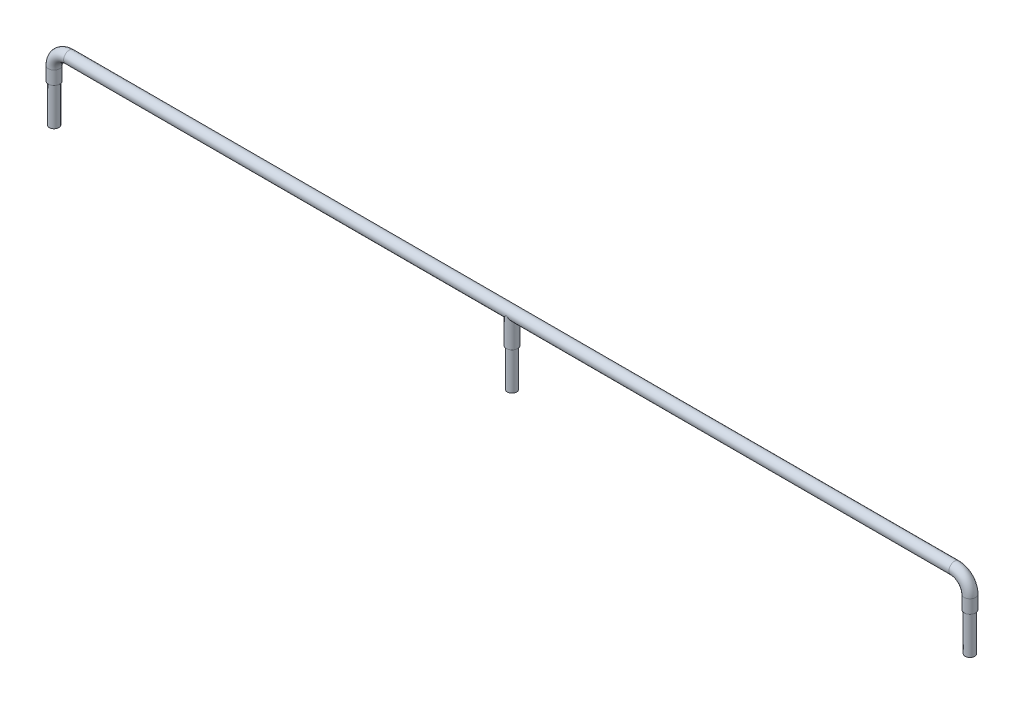
ISO-10303-21;
HEADER;
FILE_DESCRIPTION(('STEP AP214'),'2;1');
FILE_NAME('part.step','',(''),(''),'','','');
FILE_SCHEMA(('AUTOMOTIVE_DESIGN { 1 0 10303 214 1 1 1 1 }'));
ENDSEC;
DATA;
#1=APPLICATION_CONTEXT('core data for automotive mechanical design processes');
#2=APPLICATION_PROTOCOL_DEFINITION('international standard','automotive_design',2000,#1);
#3=PRODUCT_CONTEXT('',#1,'mechanical');
#4=PRODUCT('Part','Part','',(#3));
#5=PRODUCT_RELATED_PRODUCT_CATEGORY('part','',(#4));
#6=PRODUCT_DEFINITION_FORMATION('','',#4);
#7=PRODUCT_DEFINITION_CONTEXT('part definition',#1,'design');
#8=PRODUCT_DEFINITION('design','',#6,#7);
#9=PRODUCT_DEFINITION_SHAPE('','',#8);
#10=(LENGTH_UNIT() NAMED_UNIT(*) SI_UNIT(.MILLI.,.METRE.));
#11=(NAMED_UNIT(*) PLANE_ANGLE_UNIT() SI_UNIT($,.RADIAN.));
#12=(NAMED_UNIT(*) SI_UNIT($,.STERADIAN.) SOLID_ANGLE_UNIT());
#13=UNCERTAINTY_MEASURE_WITH_UNIT(LENGTH_MEASURE(1.E-05),#10,'distance_accuracy_value','');
#14=(GEOMETRIC_REPRESENTATION_CONTEXT(3) GLOBAL_UNCERTAINTY_ASSIGNED_CONTEXT((#13)) GLOBAL_UNIT_ASSIGNED_CONTEXT((#10,
#11,#12)) REPRESENTATION_CONTEXT('',''));
#15=CARTESIAN_POINT('',(0.,0.,0.));
#16=DIRECTION('',(0.,0.,1.));
#17=DIRECTION('',(1.,0.,0.));
#18=AXIS2_PLACEMENT_3D('',#15,#16,#17);
#19=CARTESIAN_POINT('',(2400.,6.10622663543836E-13,0.));
#20=DIRECTION('',(0.,1.,0.));
#21=DIRECTION('',(-1.,0.,0.));
#22=AXIS2_PLACEMENT_3D('',#19,#20,#21);
#23=PLANE('',#22);
#24=CARTESIAN_POINT('',(2400.,6.10622663543836E-13,0.));
#25=DIRECTION('',(0.,1.,0.));
#26=DIRECTION('',(-1.,0.,0.));
#27=AXIS2_PLACEMENT_3D('',#24,#25,#26);
#28=CIRCLE('',#27,19.9999999999998);
#29=CARTESIAN_POINT('',(2380.,5.11936172466045E-13,0.));
#30=VERTEX_POINT('',#29);
#31=EDGE_CURVE('E94',#30,#30,#28,.T.);
#32=ORIENTED_EDGE('',*,*,#31,.T.);
#33=EDGE_LOOP('',(#32));
#34=FACE_BOUND('',#33,.T.);
#35=CARTESIAN_POINT('',(2400.,3.94745964311167E-12,0.));
#36=DIRECTION('',(0.,-1.,0.));
#37=DIRECTION('',(1.,0.,0.));
#38=AXIS2_PLACEMENT_3D('',#35,#36,#37);
#39=CIRCLE('',#38,25.);
#40=CARTESIAN_POINT('',(2425.,3.98857901439409E-12,0.));
#41=VERTEX_POINT('',#40);
#42=EDGE_CURVE('E128',#41,#41,#39,.T.);
#43=ORIENTED_EDGE('',*,*,#42,.T.);
#44=EDGE_LOOP('',(#43));
#45=FACE_BOUND('',#44,.T.);
#46=ADVANCED_FACE('F47',(#34,#45),#23,.F.);
#47=CARTESIAN_POINT('',(2400.,270.,0.));
#48=DIRECTION('',(0.,-1.,0.));
#49=DIRECTION('',(1.,0.,0.));
#50=AXIS2_PLACEMENT_3D('',#47,#48,#49);
#51=CYLINDRICAL_SURFACE('',#50,29.9999999999998);
#52=CARTESIAN_POINT('',(2400.,270.00000000002,0.));
#53=DIRECTION('',(0.,1.,0.));
#54=DIRECTION('',(-1.,0.,0.));
#55=AXIS2_PLACEMENT_3D('',#52,#53,#54);
#56=CIRCLE('',#55,29.9999999999998);
#57=CARTESIAN_POINT('',(2430.,270.000000000027,0.));
#58=VERTEX_POINT('',#57);
#59=EDGE_CURVE('E59',#58,#58,#56,.T.);
#60=ORIENTED_EDGE('',*,*,#59,.F.);
#61=EDGE_LOOP('',(#60));
#62=FACE_BOUND('',#61,.T.);
#63=CARTESIAN_POINT('',(2400.,200.000000000004,0.));
#64=DIRECTION('',(0.,-1.,0.));
#65=DIRECTION('',(1.,0.,0.));
#66=AXIS2_PLACEMENT_3D('',#63,#64,#65);
#67=CIRCLE('',#66,29.9999999999998);
#68=CARTESIAN_POINT('',(2430.,200.000000000004,0.));
#69=VERTEX_POINT('',#68);
#70=EDGE_CURVE('E119',#69,#69,#67,.T.);
#71=ORIENTED_EDGE('',*,*,#70,.F.);
#72=EDGE_LOOP('',(#71));
#73=FACE_BOUND('',#72,.T.);
#74=ADVANCED_FACE('F113',(#62,#73),#51,.T.);
#75=CARTESIAN_POINT('',(-6.2501608826754E-13,380.001000000004,0.));
#76=DIRECTION('',(0.,-1.,0.));
#77=DIRECTION('',(1.,0.,0.));
#78=AXIS2_PLACEMENT_3D('',#75,#76,#77);
#79=CYLINDRICAL_SURFACE('',#78,29.9999999999998);
#80=CARTESIAN_POINT('',(-5.09880203901924E-13,350.,0.));
#81=DIRECTION('',(-0.707106781186547,-0.707106781186548,0.));
#82=DIRECTION('',(0.707106781186548,-0.707106781186547,0.));
#83=AXIS2_PLACEMENT_3D('',#80,#81,#82);
#84=ELLIPSE('',#83,42.4264068711926,29.9999999999998);
#85=CARTESIAN_POINT('',(-2.87835598976893E-13,350.,-29.9999999999998));
#86=VERTEX_POINT('',#85);
#87=CARTESIAN_POINT('',(-5.09880203901924E-13,350.,29.9999999999998));
#88=VERTEX_POINT('',#87);
#89=EDGE_CURVE('E67',#86,#88,#84,.T.);
#90=ORIENTED_EDGE('',*,*,#89,.T.);
#91=CARTESIAN_POINT('',(-5.09880203901924E-13,350.,0.));
#92=DIRECTION('',(0.707106781186548,-0.707106781186547,0.));
#93=DIRECTION('',(-0.707106781186547,-0.707106781186548,0.));
#94=AXIS2_PLACEMENT_3D('',#91,#92,#93);
#95=ELLIPSE('',#94,42.4264068711925,29.9999999999998);
#96=EDGE_CURVE('E65',#88,#86,#95,.T.);
#97=ORIENTED_EDGE('',*,*,#96,.T.);
#98=EDGE_LOOP('',(#90,#97));
#99=FACE_BOUND('',#98,.T.);
#100=CARTESIAN_POINT('',(-3.28954970259306E-13,200.,0.));
#101=DIRECTION('',(0.,-1.,0.));
#102=DIRECTION('',(1.,0.,0.));
#103=AXIS2_PLACEMENT_3D('',#100,#101,#102);
#104=CIRCLE('',#103,29.9999999999998);
#105=CARTESIAN_POINT('',(29.9999999999995,200.,0.));
#106=VERTEX_POINT('',#105);
#107=EDGE_CURVE('E137',#106,#106,#104,.T.);
#108=ORIENTED_EDGE('',*,*,#107,.F.);
#109=EDGE_LOOP('',(#108));
#110=FACE_BOUND('',#109,.T.);
#111=ADVANCED_FACE('F68',(#99,#110),#79,.T.);
#112=CARTESIAN_POINT('',(-2400.,7.28429662267951E-12,0.));
#113=DIRECTION('',(0.,-1.,0.));
#114=DIRECTION('',(1.,0.,0.));
#115=AXIS2_PLACEMENT_3D('',#112,#113,#114);
#116=PLANE('',#115);
#117=CARTESIAN_POINT('',(-2400.,7.28429662267951E-12,0.));
#118=DIRECTION('',(0.,-1.,0.));
#119=DIRECTION('',(1.,0.,0.));
#120=AXIS2_PLACEMENT_3D('',#117,#118,#119);
#121=CIRCLE('',#120,19.9999999999998);
#122=CARTESIAN_POINT('',(-2380.,7.31719211970544E-12,0.));
#123=VERTEX_POINT('',#122);
#124=EDGE_CURVE('E71',#123,#123,#121,.T.);
#125=ORIENTED_EDGE('',*,*,#124,.F.);
#126=EDGE_LOOP('',(#125));
#127=FACE_BOUND('',#126,.T.);
#128=CARTESIAN_POINT('',(-2400.,-3.94745964311167E-12,0.));
#129=DIRECTION('',(0.,-1.,0.));
#130=DIRECTION('',(1.,0.,0.));
#131=AXIS2_PLACEMENT_3D('',#128,#129,#130);
#132=CIRCLE('',#131,25.);
#133=CARTESIAN_POINT('',(-2375.,-3.90634027182926E-12,0.));
#134=VERTEX_POINT('',#133);
#135=EDGE_CURVE('E135',#134,#134,#132,.T.);
#136=ORIENTED_EDGE('',*,*,#135,.T.);
#137=EDGE_LOOP('',(#136));
#138=FACE_BOUND('',#137,.T.);
#139=ADVANCED_FACE('F49',(#127,#138),#116,.T.);
#140=CARTESIAN_POINT('',(-2400.,7.28429662267951E-12,0.));
#141=DIRECTION('',(0.,1.,0.));
#142=DIRECTION('',(0.,0.,1.));
#143=AXIS2_PLACEMENT_3D('',#140,#141,#142);
#144=CYLINDRICAL_SURFACE('',#143,29.9999999999998);
#145=CARTESIAN_POINT('',(-2400.,269.999999999999,0.));
#146=DIRECTION('',(0.,-1.,0.));
#147=DIRECTION('',(1.,0.,0.));
#148=AXIS2_PLACEMENT_3D('',#145,#146,#147);
#149=CIRCLE('',#148,29.9999999999998);
#150=CARTESIAN_POINT('',(-2430.,269.999999999999,0.));
#151=VERTEX_POINT('',#150);
#152=EDGE_CURVE('E99',#151,#151,#149,.T.);
#153=ORIENTED_EDGE('',*,*,#152,.T.);
#154=EDGE_LOOP('',(#153));
#155=FACE_BOUND('',#154,.T.);
#156=CARTESIAN_POINT('',(-2400.,199.999999999996,0.));
#157=DIRECTION('',(0.,-1.,0.));
#158=DIRECTION('',(1.,0.,0.));
#159=AXIS2_PLACEMENT_3D('',#156,#157,#158);
#160=CIRCLE('',#159,29.9999999999998);
#161=CARTESIAN_POINT('',(-2370.,199.999999999996,0.));
#162=VERTEX_POINT('',#161);
#163=EDGE_CURVE('E78',#162,#162,#160,.T.);
#164=ORIENTED_EDGE('',*,*,#163,.F.);
#165=EDGE_LOOP('',(#164));
#166=FACE_BOUND('',#165,.T.);
#167=ADVANCED_FACE('F143',(#155,#166),#144,.T.);
#168=CARTESIAN_POINT('',(-2320.,270.,0.));
#169=DIRECTION('',(0.,0.,-1.));
#170=DIRECTION('',(-1.,0.,0.));
#171=AXIS2_PLACEMENT_3D('',#168,#169,#170);
#172=TOROIDAL_SURFACE('',#171,80.0000000000001,29.9999999999998);
#173=CARTESIAN_POINT('',(-2320.,350.,0.));
#174=DIRECTION('',(-1.,0.,0.));
#175=DIRECTION('',(0.,-1.,0.));
#176=AXIS2_PLACEMENT_3D('',#173,#174,#175);
#177=CIRCLE('',#176,29.9999999999998);
#178=CARTESIAN_POINT('',(-2320.,380.,0.));
#179=VERTEX_POINT('',#178);
#180=EDGE_CURVE('E102',#179,#179,#177,.T.);
#181=CARTESIAN_POINT('',(-2320.,270.,0.));
#182=DIRECTION('',(0.,0.,-1.));
#183=DIRECTION('',(-1.,0.,0.));
#184=AXIS2_PLACEMENT_3D('',#181,#182,#183);
#185=CIRCLE('',#184,110.);
#186=EDGE_CURVE('',#151,#179,#185,.T.);
#187=ORIENTED_EDGE('',*,*,#152,.F.);
#188=ORIENTED_EDGE('',*,*,#180,.T.);
#189=ORIENTED_EDGE('',*,*,#186,.T.);
#190=ORIENTED_EDGE('',*,*,#186,.F.);
#191=EDGE_LOOP('',(#187,#189,#188,#190));
#192=FACE_BOUND('',#191,.T.);
#193=ADVANCED_FACE('F145',(#192),#172,.T.);
#194=CARTESIAN_POINT('',(-2320.,350.,0.));
#195=DIRECTION('',(1.,0.,0.));
#196=DIRECTION('',(0.,1.,0.));
#197=AXIS2_PLACEMENT_3D('',#194,#195,#196);
#198=CYLINDRICAL_SURFACE('',#197,29.9999999999998);
#199=ORIENTED_EDGE('',*,*,#89,.F.);
#200=ORIENTED_EDGE('',*,*,#96,.F.);
#201=EDGE_LOOP('',(#199,#200));
#202=FACE_BOUND('',#201,.T.);
#203=CARTESIAN_POINT('',(2320.,350.000000000001,0.));
#204=DIRECTION('',(-1.,0.,0.));
#205=DIRECTION('',(0.,-1.,0.));
#206=AXIS2_PLACEMENT_3D('',#203,#204,#205);
#207=CIRCLE('',#206,29.9999999999998);
#208=CARTESIAN_POINT('',(2320.,380.,0.));
#209=VERTEX_POINT('',#208);
#210=EDGE_CURVE('E105',#209,#209,#207,.T.);
#211=ORIENTED_EDGE('',*,*,#210,.T.);
#212=EDGE_LOOP('',(#211));
#213=FACE_BOUND('',#212,.T.);
#214=ORIENTED_EDGE('',*,*,#180,.F.);
#215=EDGE_LOOP('',(#214));
#216=FACE_BOUND('',#215,.T.);
#217=ADVANCED_FACE('F73',(#202,#213,#216),#198,.T.);
#218=CARTESIAN_POINT('',(2320.,270.000000000001,0.));
#219=DIRECTION('',(0.,0.,-1.));
#220=DIRECTION('',(-1.,0.,0.));
#221=AXIS2_PLACEMENT_3D('',#218,#219,#220);
#222=TOROIDAL_SURFACE('',#221,79.9999999999998,29.9999999999998);
#223=CARTESIAN_POINT('',(2320.,270.000000000001,0.));
#224=DIRECTION('',(0.,0.,-1.));
#225=DIRECTION('',(-1.,0.,0.));
#226=AXIS2_PLACEMENT_3D('',#223,#224,#225);
#227=CIRCLE('',#226,110.);
#228=EDGE_CURVE('',#209,#58,#227,.T.);
#229=ORIENTED_EDGE('',*,*,#210,.F.);
#230=ORIENTED_EDGE('',*,*,#59,.T.);
#231=ORIENTED_EDGE('',*,*,#228,.T.);
#232=ORIENTED_EDGE('',*,*,#228,.F.);
#233=EDGE_LOOP('',(#229,#231,#230,#232));
#234=FACE_BOUND('',#233,.T.);
#235=ADVANCED_FACE('F110',(#234),#222,.T.);
#236=CARTESIAN_POINT('',(-2400.,7.28429662267951E-12,0.));
#237=DIRECTION('',(0.,1.,0.));
#238=DIRECTION('',(0.,0.,1.));
#239=AXIS2_PLACEMENT_3D('',#236,#237,#238);
#240=CYLINDRICAL_SURFACE('',#239,19.9999999999998);
#241=CARTESIAN_POINT('',(-2400.,269.999999999999,0.));
#242=DIRECTION('',(0.,1.,0.));
#243=DIRECTION('',(0.,0.,1.));
#244=AXIS2_PLACEMENT_3D('',#241,#242,#243);
#245=CIRCLE('',#244,19.9999999999998);
#246=CARTESIAN_POINT('',(-2420.,269.999999999999,0.));
#247=VERTEX_POINT('',#246);
#248=EDGE_CURVE('E82',#247,#247,#245,.F.);
#249=ORIENTED_EDGE('',*,*,#248,.F.);
#250=EDGE_LOOP('',(#249));
#251=FACE_BOUND('',#250,.T.);
#252=ORIENTED_EDGE('',*,*,#124,.T.);
#253=EDGE_LOOP('',(#252));
#254=FACE_BOUND('',#253,.T.);
#255=ADVANCED_FACE('F158',(#251,#254),#240,.F.);
#256=CARTESIAN_POINT('',(-2320.,270.,0.));
#257=DIRECTION('',(0.,0.,-1.));
#258=DIRECTION('',(-1.,0.,0.));
#259=AXIS2_PLACEMENT_3D('',#256,#257,#258);
#260=TOROIDAL_SURFACE('',#259,80.0000000000001,19.9999999999998);
#261=CARTESIAN_POINT('',(-2320.,350.,0.));
#262=DIRECTION('',(-1.,0.,0.));
#263=DIRECTION('',(0.,-1.,0.));
#264=AXIS2_PLACEMENT_3D('',#261,#262,#263);
#265=CIRCLE('',#264,19.9999999999998);
#266=CARTESIAN_POINT('',(-2320.,370.,0.));
#267=VERTEX_POINT('',#266);
#268=EDGE_CURVE('E85',#267,#267,#265,.T.);
#269=CARTESIAN_POINT('',(-2320.,270.,0.));
#270=DIRECTION('',(0.,0.,-1.));
#271=DIRECTION('',(-1.,0.,0.));
#272=AXIS2_PLACEMENT_3D('',#269,#270,#271);
#273=CIRCLE('',#272,99.9999999999999);
#274=EDGE_CURVE('',#247,#267,#273,.T.);
#275=ORIENTED_EDGE('',*,*,#248,.T.);
#276=ORIENTED_EDGE('',*,*,#268,.F.);
#277=ORIENTED_EDGE('',*,*,#274,.T.);
#278=ORIENTED_EDGE('',*,*,#274,.F.);
#279=EDGE_LOOP('',(#275,#277,#276,#278));
#280=FACE_BOUND('',#279,.T.);
#281=ADVANCED_FACE('F211',(#280),#260,.F.);
#282=CARTESIAN_POINT('',(-2320.,350.,0.));
#283=DIRECTION('',(1.,0.,0.));
#284=DIRECTION('',(0.,1.,0.));
#285=AXIS2_PLACEMENT_3D('',#282,#283,#284);
#286=CYLINDRICAL_SURFACE('',#285,19.9999999999998);
#287=CARTESIAN_POINT('',(2320.,350.000000000001,0.));
#288=DIRECTION('',(1.,0.,0.));
#289=DIRECTION('',(0.,1.,0.));
#290=AXIS2_PLACEMENT_3D('',#287,#288,#289);
#291=CIRCLE('',#290,19.9999999999998);
#292=CARTESIAN_POINT('',(2320.,370.,0.));
#293=VERTEX_POINT('',#292);
#294=EDGE_CURVE('E88',#293,#293,#291,.F.);
#295=ORIENTED_EDGE('',*,*,#294,.F.);
#296=EDGE_LOOP('',(#295));
#297=FACE_BOUND('',#296,.T.);
#298=ORIENTED_EDGE('',*,*,#268,.T.);
#299=EDGE_LOOP('',(#298));
#300=FACE_BOUND('',#299,.T.);
#301=ADVANCED_FACE('F215',(#297,#300),#286,.F.);
#302=CARTESIAN_POINT('',(2320.,270.000000000001,0.));
#303=DIRECTION('',(0.,0.,-1.));
#304=DIRECTION('',(-1.,0.,0.));
#305=AXIS2_PLACEMENT_3D('',#302,#303,#304);
#306=TOROIDAL_SURFACE('',#305,79.9999999999998,19.9999999999998);
#307=CARTESIAN_POINT('',(2400.,270.000000000015,0.));
#308=DIRECTION('',(-1.75537702570689E-13,1.,0.));
#309=DIRECTION('',(-1.,-1.75537702570689E-13,0.));
#310=AXIS2_PLACEMENT_3D('',#307,#308,#309);
#311=CIRCLE('',#310,19.9999999999998);
#312=CARTESIAN_POINT('',(2420.,270.000000000018,0.));
#313=VERTEX_POINT('',#312);
#314=EDGE_CURVE('E91',#313,#313,#311,.T.);
#315=CARTESIAN_POINT('',(2320.,270.000000000001,0.));
#316=DIRECTION('',(0.,0.,-1.));
#317=DIRECTION('',(-1.,0.,0.));
#318=AXIS2_PLACEMENT_3D('',#315,#316,#317);
#319=CIRCLE('',#318,99.9999999999996);
#320=EDGE_CURVE('',#293,#313,#319,.T.);
#321=ORIENTED_EDGE('',*,*,#294,.T.);
#322=ORIENTED_EDGE('',*,*,#314,.F.);
#323=ORIENTED_EDGE('',*,*,#320,.T.);
#324=ORIENTED_EDGE('',*,*,#320,.F.);
#325=EDGE_LOOP('',(#321,#323,#322,#324));
#326=FACE_BOUND('',#325,.T.);
#327=ADVANCED_FACE('F219',(#326),#306,.F.);
#328=CARTESIAN_POINT('',(2400.,270.,0.));
#329=DIRECTION('',(0.,-1.,0.));
#330=DIRECTION('',(1.,0.,0.));
#331=AXIS2_PLACEMENT_3D('',#328,#329,#330);
#332=CYLINDRICAL_SURFACE('',#331,19.9999999999998);
#333=ORIENTED_EDGE('',*,*,#31,.F.);
#334=EDGE_LOOP('',(#333));
#335=FACE_BOUND('',#334,.T.);
#336=ORIENTED_EDGE('',*,*,#314,.T.);
#337=EDGE_LOOP('',(#336));
#338=FACE_BOUND('',#337,.T.);
#339=ADVANCED_FACE('F154',(#335,#338),#332,.F.);
#340=CARTESIAN_POINT('',(-2400.,199.999999999996,0.));
#341=DIRECTION('',(0.,-1.,0.));
#342=DIRECTION('',(1.,0.,0.));
#343=AXIS2_PLACEMENT_3D('',#340,#341,#342);
#344=PLANE('',#343);
#345=CARTESIAN_POINT('',(-2400.,199.999999999996,0.));
#346=DIRECTION('',(0.,-1.,0.));
#347=DIRECTION('',(1.,0.,0.));
#348=AXIS2_PLACEMENT_3D('',#345,#346,#347);
#349=CIRCLE('',#348,25.);
#350=CARTESIAN_POINT('',(-2375.,199.999999999996,0.));
#351=VERTEX_POINT('',#350);
#352=EDGE_CURVE('E132',#351,#351,#349,.T.);
#353=ORIENTED_EDGE('',*,*,#352,.F.);
#354=EDGE_LOOP('',(#353));
#355=FACE_BOUND('',#354,.T.);
#356=ORIENTED_EDGE('',*,*,#163,.T.);
#357=EDGE_LOOP('',(#356));
#358=FACE_BOUND('',#357,.T.);
#359=ADVANCED_FACE('F141',(#355,#358),#344,.T.);
#360=CARTESIAN_POINT('',(-2400.,199.999999999996,0.));
#361=DIRECTION('',(0.,-1.,0.));
#362=DIRECTION('',(1.,0.,0.));
#363=AXIS2_PLACEMENT_3D('',#360,#361,#362);
#364=CYLINDRICAL_SURFACE('',#363,25.);
#365=ORIENTED_EDGE('',*,*,#352,.T.);
#366=EDGE_LOOP('',(#365));
#367=FACE_BOUND('',#366,.T.);
#368=ORIENTED_EDGE('',*,*,#135,.F.);
#369=EDGE_LOOP('',(#368));
#370=FACE_BOUND('',#369,.T.);
#371=ADVANCED_FACE('F196',(#367,#370),#364,.T.);
#372=CARTESIAN_POINT('',(-3.28954970259306E-13,200.,0.));
#373=DIRECTION('',(0.,-1.,0.));
#374=DIRECTION('',(1.,0.,0.));
#375=AXIS2_PLACEMENT_3D('',#372,#373,#374);
#376=PLANE('',#375);
#377=CARTESIAN_POINT('',(-3.28954970259306E-13,200.,0.));
#378=DIRECTION('',(0.,-1.,0.));
#379=DIRECTION('',(1.,0.,0.));
#380=AXIS2_PLACEMENT_3D('',#377,#378,#379);
#381=CIRCLE('',#380,25.);
#382=CARTESIAN_POINT('',(24.9999999999997,200.,0.));
#383=VERTEX_POINT('',#382);
#384=EDGE_CURVE('E125',#383,#383,#381,.T.);
#385=ORIENTED_EDGE('',*,*,#384,.F.);
#386=EDGE_LOOP('',(#385));
#387=FACE_BOUND('',#386,.T.);
#388=ORIENTED_EDGE('',*,*,#107,.T.);
#389=EDGE_LOOP('',(#388));
#390=FACE_BOUND('',#389,.T.);
#391=ADVANCED_FACE('F193',(#387,#390),#376,.T.);
#392=CARTESIAN_POINT('',(-3.28954970259306E-13,200.,0.));
#393=DIRECTION('',(0.,-1.,0.));
#394=DIRECTION('',(1.,0.,0.));
#395=AXIS2_PLACEMENT_3D('',#392,#393,#394);
#396=CYLINDRICAL_SURFACE('',#395,25.);
#397=ORIENTED_EDGE('',*,*,#384,.T.);
#398=EDGE_LOOP('',(#397));
#399=FACE_BOUND('',#398,.T.);
#400=CARTESIAN_POINT('',(0.,0.,0.));
#401=DIRECTION('',(0.,-1.,0.));
#402=DIRECTION('',(1.,0.,0.));
#403=AXIS2_PLACEMENT_3D('',#400,#401,#402);
#404=CIRCLE('',#403,25.);
#405=CARTESIAN_POINT('',(25.,0.,0.));
#406=VERTEX_POINT('',#405);
#407=EDGE_CURVE('E121',#406,#406,#404,.T.);
#408=ORIENTED_EDGE('',*,*,#407,.F.);
#409=EDGE_LOOP('',(#408));
#410=FACE_BOUND('',#409,.T.);
#411=ADVANCED_FACE('F188',(#399,#410),#396,.T.);
#412=CARTESIAN_POINT('',(2400.,200.000000000004,0.));
#413=DIRECTION('',(0.,-1.,0.));
#414=DIRECTION('',(1.,0.,0.));
#415=AXIS2_PLACEMENT_3D('',#412,#413,#414);
#416=PLANE('',#415);
#417=CARTESIAN_POINT('',(2400.,200.000000000004,0.));
#418=DIRECTION('',(0.,-1.,0.));
#419=DIRECTION('',(1.,0.,0.));
#420=AXIS2_PLACEMENT_3D('',#417,#418,#419);
#421=CIRCLE('',#420,25.);
#422=CARTESIAN_POINT('',(2425.,200.000000000004,0.));
#423=VERTEX_POINT('',#422);
#424=EDGE_CURVE('E122',#423,#423,#421,.T.);
#425=ORIENTED_EDGE('',*,*,#424,.F.);
#426=EDGE_LOOP('',(#425));
#427=FACE_BOUND('',#426,.T.);
#428=ORIENTED_EDGE('',*,*,#70,.T.);
#429=EDGE_LOOP('',(#428));
#430=FACE_BOUND('',#429,.T.);
#431=ADVANCED_FACE('F180',(#427,#430),#416,.T.);
#432=CARTESIAN_POINT('',(2400.,200.000000000004,0.));
#433=DIRECTION('',(0.,-1.,0.));
#434=DIRECTION('',(1.,0.,0.));
#435=AXIS2_PLACEMENT_3D('',#432,#433,#434);
#436=CYLINDRICAL_SURFACE('',#435,25.);
#437=ORIENTED_EDGE('',*,*,#424,.T.);
#438=EDGE_LOOP('',(#437));
#439=FACE_BOUND('',#438,.T.);
#440=ORIENTED_EDGE('',*,*,#42,.F.);
#441=EDGE_LOOP('',(#440));
#442=FACE_BOUND('',#441,.T.);
#443=ADVANCED_FACE('F172',(#439,#442),#436,.T.);
#444=CARTESIAN_POINT('',(19.9999999999995,320.,0.));
#445=CARTESIAN_POINT('',(19.999999870815,320.000000133802,-0.502432050357106));
#446=CARTESIAN_POINT('',(19.9810418902205,320.012648723208,-1.00486659291617));
#447=CARTESIAN_POINT('',(19.9055087079436,320.062924549288,-2.00562861223446));
#448=CARTESIAN_POINT('',(19.848933308268,320.100551917434,-2.50395606736271));
#449=CARTESIAN_POINT('',(19.6990002879962,320.199874786451,-3.49278874290094));
#450=CARTESIAN_POINT('',(19.6056283291336,320.261579669351,-3.98329083644028));
#451=CARTESIAN_POINT('',(19.3834395211624,320.4075901339,-4.95273670189949));
#452=CARTESIAN_POINT('',(19.2546222434638,320.491895988829,-5.43168033398314));
#453=CARTESIAN_POINT('',(18.9639204802119,320.680754864915,-6.37268315299049));
#454=CARTESIAN_POINT('',(18.8021969068237,320.785209235055,-6.83481207132657));
#455=CARTESIAN_POINT('',(18.4471586375464,321.012432664341,-7.74207070686116));
#456=CARTESIAN_POINT('',(18.2538441050979,321.135201628734,-8.1872005119924));
#457=CARTESIAN_POINT('',(17.8375381124744,321.396651799699,-9.05844037609496));
#458=CARTESIAN_POINT('',(17.6145476201092,321.535332487327,-9.48455105472423));
#459=CARTESIAN_POINT('',(17.1407197895652,321.826088675287,-10.3162415378409));
#460=CARTESIAN_POINT('',(16.8898791680595,321.978165754518,-10.7218189133777));
#461=CARTESIAN_POINT('',(16.3397046695654,322.306442158243,-11.544666651525));
#462=CARTESIAN_POINT('',(16.0380625153583,322.483593497589,-11.9600134544701));
#463=CARTESIAN_POINT('',(15.4060039283262,322.847134378905,-12.7638755092378));
#464=CARTESIAN_POINT('',(15.0755861890751,323.033524340148,-13.1523895414017));
#465=CARTESIAN_POINT('',(14.3871695519224,323.4122603668,-13.9021114634373));
#466=CARTESIAN_POINT('',(14.0291344326557,323.604614049252,-14.2632822184454));
#467=CARTESIAN_POINT('',(13.2872215493214,323.991346944818,-14.9568597365415));
#468=CARTESIAN_POINT('',(12.9033422589609,324.185726276988,-15.2892647981446));
#469=CARTESIAN_POINT('',(12.0482275933548,324.603163351101,-15.9745417178036));
#470=CARTESIAN_POINT('',(11.5727693191122,324.825903463734,-16.3223586443349));
#471=CARTESIAN_POINT('',(10.5899657994351,325.262306065545,-16.9764877633748));
#472=CARTESIAN_POINT('',(10.0826133516478,325.475966485955,-17.2827905315005));
#473=CARTESIAN_POINT('',(9.03819236671085,325.886545802438,-17.8511644026811));
#474=CARTESIAN_POINT('',(8.50116549380695,326.083487233875,-18.1132955295477));
#475=CARTESIAN_POINT('',(7.39870988362494,326.452778856693,-18.5908454263022));
#476=CARTESIAN_POINT('',(6.83329494919993,326.625140845503,-18.8062866319954));
#477=CARTESIAN_POINT('',(5.84404921175341,326.891644530006,-19.13202887715));
#478=CARTESIAN_POINT('',(5.42648017350454,326.994001174351,-19.254726201792));
#479=CARTESIAN_POINT('',(4.58008091505651,327.178809682322,-19.4734126020971));
#480=CARTESIAN_POINT('',(4.15125254556373,327.261264794751,-19.5694060373963));
#481=CARTESIAN_POINT('',(3.28516192271584,327.40331572389,-19.7332623242764));
#482=CARTESIAN_POINT('',(2.84791313270926,327.462945289373,-19.8011667190628));
#483=CARTESIAN_POINT('',(1.967177471033,327.557224813252,-19.9079619855319));
#484=CARTESIAN_POINT('',(1.52369056519011,327.591874634753,-19.9468526982109));
#485=CARTESIAN_POINT('',(0.631973802665473,327.634842195251,-19.995018995311));
#486=CARTESIAN_POINT('',(0.183731910266949,327.643050298475,-20.0041712760879));
#487=CARTESIAN_POINT('',(-0.71203065874094,327.632469830899,-19.9923398271623));
#488=CARTESIAN_POINT('',(-1.15955133289529,327.613681168395,-19.971355995093));
#489=CARTESIAN_POINT('',(-2.05062509539248,327.54989131428,-19.8996205096492));
#490=CARTESIAN_POINT('',(-2.4941749867726,327.504870645867,-19.8488467375743));
#491=CARTESIAN_POINT('',(-3.3737749273935,327.390441834478,-19.7184018881212));
#492=CARTESIAN_POINT('',(-3.80982483343092,327.321033226384,-19.6387302596127));
#493=CARTESIAN_POINT('',(-4.65260599507418,327.163997959636,-19.4558684710411));
#494=CARTESIAN_POINT('',(-5.05977803330703,327.077320501357,-19.3538839737257));
#495=CARTESIAN_POINT('',(-5.86323587316221,326.886691047175,-19.1258219416928));
#496=CARTESIAN_POINT('',(-6.25951739443538,326.782732369186,-18.9997350845369));
#497=CARTESIAN_POINT('',(-7.42993067111899,326.449099473677,-18.5870898788948));
#498=CARTESIAN_POINT('',(-8.18608179416553,326.19757909867,-18.2660472919538));
#499=CARTESIAN_POINT('',(-9.3522872667311,325.765743067048,-17.6854431992286));
#500=CARTESIAN_POINT('',(-9.78032481496484,325.596922682217,-17.4522559964646));
#501=CARTESIAN_POINT('',(-10.6157476442307,325.250256729435,-16.957048387659));
#502=CARTESIAN_POINT('',(-11.0231309475294,325.072410300451,-16.6950252280376));
#503=CARTESIAN_POINT('',(-11.8167546644326,324.711453105028,-16.1430567151302));
#504=CARTESIAN_POINT('',(-12.2029713238626,324.528336762114,-15.8530809594393));
#505=CARTESIAN_POINT('',(-12.9530389311321,324.160603494803,-15.246358714758));
#506=CARTESIAN_POINT('',(-13.3168883905752,323.975986471467,-14.9296104475492));
#507=CARTESIAN_POINT('',(-14.0973031971295,323.568950226168,-14.1989483888887));
#508=CARTESIAN_POINT('',(-14.5083033678115,323.346969604331,-13.7788159652826));
#509=CARTESIAN_POINT('',(-15.2937513429526,322.911403466383,-12.9014676729699));
#510=CARTESIAN_POINT('',(-15.6681924187191,322.697819499979,-12.4442450060577));
#511=CARTESIAN_POINT('',(-16.3775183221483,322.284659865137,-11.494686117609));
#512=CARTESIAN_POINT('',(-16.7124321311589,322.085073977438,-11.0023760522688));
#513=CARTESIAN_POINT('',(-17.3397652164751,321.705032372085,-9.9844735424079));
#514=CARTESIAN_POINT('',(-17.6321961852132,321.524571394447,-9.45889031296233));
#515=CARTESIAN_POINT('',(-18.1181905483141,321.220835593119,-8.48334612274983));
#516=CARTESIAN_POINT('',(-18.3198975753376,321.093285202127,-8.03875717640129));
#517=CARTESIAN_POINT('',(-18.6916231628035,320.856282694799,-7.13185034835589));
#518=CARTESIAN_POINT('',(-18.8616454276108,320.746828462953,-6.66953454679123));
#519=CARTESIAN_POINT('',(-19.1679937956708,320.548372248578,-5.72992272771904));
#520=CARTESIAN_POINT('',(-19.3043425302526,320.459356532561,-5.25263701566206));
#521=CARTESIAN_POINT('',(-19.5417523912569,320.303669450775,-4.28575432400361));
#522=CARTESIAN_POINT('',(-19.6428129748482,320.236998428731,-3.7961571551415));
#523=CARTESIAN_POINT('',(-19.8085733139668,320.127342105029,-2.80597314349139));
#524=CARTESIAN_POINT('',(-19.8731120951369,320.084461679353,-2.3053475990311));
#525=CARTESIAN_POINT('',(-19.9641545523489,320.023904397846,-1.29911991465971));
#526=CARTESIAN_POINT('',(-19.990658178691,320.00622757495,-0.793517768246678));
#527=CARTESIAN_POINT('',(-20.005208032861,319.996528204881,0.218464736426903));
#528=CARTESIAN_POINT('',(-19.9932558457623,320.004504600334,0.724845061752529));
#529=CARTESIAN_POINT('',(-19.9310874554946,320.045906676834,1.7341815678445));
#530=CARTESIAN_POINT('',(-19.880872885445,320.079331271698,2.23713789382999));
#531=CARTESIAN_POINT('',(-19.7478312691319,320.167558549307,3.2004217641102));
#532=CARTESIAN_POINT('',(-19.6675483452088,320.22069099574,3.66125811656805));
#533=CARTESIAN_POINT('',(-19.4756341111477,320.347089351856,4.57350157570495));
#534=CARTESIAN_POINT('',(-19.364004565487,320.4203541283,5.02490921158309));
#535=CARTESIAN_POINT('',(-19.1106977521886,320.585555333433,5.91571607198143));
#536=CARTESIAN_POINT('',(-18.9690185284523,320.677492977624,6.35511451265412));
#537=CARTESIAN_POINT('',(-18.6571079304237,320.878299505293,7.21966385402612));
#538=CARTESIAN_POINT('',(-18.4868750352666,320.987169290612,7.64481399436492));
#539=CARTESIAN_POINT('',(-18.1083152340673,321.226951155758,8.50426678457429));
#540=CARTESIAN_POINT('',(-17.8983067263238,321.358798308333,8.93756698372219));
#541=CARTESIAN_POINT('',(-17.4498297986436,321.636896978886,9.78432512725692));
#542=CARTESIAN_POINT('',(-17.211360522316,321.783148930285,10.1977824740428));
#543=CARTESIAN_POINT('',(-16.707624201864,322.08755814064,11.0036909497808));
#544=CARTESIAN_POINT('',(-16.4423452174866,322.245720696165,11.3961325988639));
#545=CARTESIAN_POINT('',(-15.8866695617361,322.571263831729,12.1587990167242));
#546=CARTESIAN_POINT('',(-15.596270090312,322.73864543861,12.5290213010129));
#547=CARTESIAN_POINT('',(-14.9439528947202,323.106912025991,13.303134717869));
#548=CARTESIAN_POINT('',(-14.5779874749771,323.308909483677,13.703092384124));
#549=CARTESIAN_POINT('',(-13.8160664974295,323.7173017054,14.4709683638238));
#550=CARTESIAN_POINT('',(-13.4201069693148,323.923697048974,14.8388824217614));
#551=CARTESIAN_POINT('',(-12.5994023240141,324.336426030242,15.5417880165118));
#552=CARTESIAN_POINT('',(-12.1746378391387,324.542759530822,15.8767570235969));
#553=CARTESIAN_POINT('',(-11.2977646153292,324.950273850767,16.5122275702685));
#554=CARTESIAN_POINT('',(-10.8456586765934,325.151455194802,16.8127326304099));
#555=CARTESIAN_POINT('',(-9.95448274755351,325.526697697001,17.3538627139577));
#556=CARTESIAN_POINT('',(-9.51754297050587,325.701613634313,17.5974024349064));
#557=CARTESIAN_POINT('',(-8.62244520074642,326.038059275326,18.0528546349535));
#558=CARTESIAN_POINT('',(-8.16428690077762,326.19958878509,18.2647666558761));
#559=CARTESIAN_POINT('',(-7.22866142786322,326.504080937808,18.6548371117045));
#560=CARTESIAN_POINT('',(-6.75122376801356,326.647070646745,18.833044929394));
#561=CARTESIAN_POINT('',(-5.7782748013002,326.909540864697,19.1539484457237));
#562=CARTESIAN_POINT('',(-5.28276767814804,327.029026775206,19.2966523056608));
#563=CARTESIAN_POINT('',(-4.36698264384123,327.220455487852,19.5220414226083));
#564=CARTESIAN_POINT('',(-3.94920001272016,327.297083916296,19.6109049179647));
#565=CARTESIAN_POINT('',(-3.1054686934571,327.428548605639,19.7620762933324));
#566=CARTESIAN_POINT('',(-2.6795209954084,327.483387491427,19.82438737206));
#567=CARTESIAN_POINT('',(-1.82249119083061,327.569219775613,19.9214537495162));
#568=CARTESIAN_POINT('',(-1.39141418836788,327.600235145219,19.9562344390175));
#569=CARTESIAN_POINT('',(-0.526818989047074,327.637284822714,19.9977438544737));
#570=CARTESIAN_POINT('',(-0.0933007566543476,327.643318766027,20.0044721710347));
#571=CARTESIAN_POINT('',(0.773115287328161,327.630155013798,19.9897505651309));
#572=CARTESIAN_POINT('',(1.20601260355471,327.610942914494,19.9682845568072));
#573=CARTESIAN_POINT('',(2.0677026158413,327.548035560356,19.89752521375));
#574=CARTESIAN_POINT('',(2.49649534552098,327.50434050623,19.84823210714));
#575=CARTESIAN_POINT('',(3.34758196945603,327.394071502717,19.7225495457304));
#576=CARTESIAN_POINT('',(3.76986789699107,327.327471525771,19.6461292623078));
#577=CARTESIAN_POINT('',(4.6050811737755,327.173739788003,19.4672984586528));
#578=CARTESIAN_POINT('',(5.01800731354307,327.086605390093,19.3648846001244));
#579=CARTESIAN_POINT('',(5.94123169432009,326.86891810934,19.1046848410163));
#580=CARTESIAN_POINT('',(6.44816076864124,326.732982481687,18.9394160062733));
#581=CARTESIAN_POINT('',(7.44147650640385,326.43837218777,18.5716220555324));
#582=CARTESIAN_POINT('',(7.92785746170532,326.279691256083,18.369086669714));
#583=CARTESIAN_POINT('',(8.87885978411717,325.945150509923,17.9287680293191));
#584=CARTESIAN_POINT('',(9.3434571851727,325.769272402353,17.6909470983743));
#585=CARTESIAN_POINT('',(10.2491849776668,325.405819743698,17.182085076622));
#586=CARTESIAN_POINT('',(10.6903166066729,325.218245810577,16.9110457402248));
#587=CARTESIAN_POINT('',(11.5560455039419,324.832774436791,16.3319905343256));
#588=CARTESIAN_POINT('',(11.9801968484704,324.634751360911,16.0233924051235));
#589=CARTESIAN_POINT('',(12.8022908705134,324.236277423694,15.3745104302453));
#590=CARTESIAN_POINT('',(13.2002336119132,324.035826568277,15.0342266618101));
#591=CARTESIAN_POINT('',(13.9688530344086,323.636749749711,14.3228973596638));
#592=CARTESIAN_POINT('',(14.3395218599593,323.438124326634,13.9518430282372));
#593=CARTESIAN_POINT('',(15.0520096270209,323.046811222723,13.1800178893762));
#594=CARTESIAN_POINT('',(15.3938261671819,322.854124036968,12.7792446136653));
#595=CARTESIAN_POINT('',(16.0937728405192,322.451567255576,11.8892953412502));
#596=CARTESIAN_POINT('',(16.4471788212638,322.243212145854,11.3956949938794));
#597=CARTESIAN_POINT('',(17.1106254017975,321.845016067855,10.3729470334893));
#598=CARTESIAN_POINT('',(17.4206596792793,321.655177800003,9.84379425458753));
#599=CARTESIAN_POINT('',(17.993210438074,321.299733045949,8.75345833781658));
#600=CARTESIAN_POINT('',(18.2557852367728,321.134096869278,8.19231563994976));
#601=CARTESIAN_POINT('',(18.7298173077682,320.831992392152,7.04137086874983));
#602=CARTESIAN_POINT('',(18.9412925311514,320.695513850689,6.45157894748371));
#603=CARTESIAN_POINT('',(19.2683981125318,320.482896168735,5.38222751658756));
#604=CARTESIAN_POINT('',(19.3948839484341,320.400087927373,4.90728446450041));
#605=CARTESIAN_POINT('',(19.6130133781997,320.256706447601,3.94618639128313));
#606=CARTESIAN_POINT('',(19.704662594217,320.196129621399,3.46003319276121));
#607=CARTESIAN_POINT('',(19.851793361246,320.098651110834,2.48023551916975));
#608=CARTESIAN_POINT('',(19.9072972061543,320.06173483324,1.98659585428416));
#609=CARTESIAN_POINT('',(19.9814012816262,320.012408751946,0.995305041117429));
#610=CARTESIAN_POINT('',(20.0000001279553,319.999999867471,0.497653743070673));
#611=CARTESIAN_POINT('',(19.9999999999995,320.,0.));
#612=B_SPLINE_CURVE_WITH_KNOTS('',3,(#444,#445,#446,#447,#448,#449,#450,#451,#452,#453,#454,
#455,#456,#457,#458,#459,#460,#461,#462,#463,#464,#465,#466,#467,#468,#469,#470,#471,#472,#473,
#474,#475,#476,#477,#478,#479,#480,#481,#482,#483,#484,#485,#486,#487,#488,#489,#490,#491,#492,
#493,#494,#495,#496,#497,#498,#499,#500,#501,#502,#503,#504,#505,#506,#507,#508,#509,#510,#511,
#512,#513,#514,#515,#516,#517,#518,#519,#520,#521,#522,#523,#524,#525,#526,#527,#528,#529,#530,
#531,#532,#533,#534,#535,#536,#537,#538,#539,#540,#541,#542,#543,#544,#545,#546,#547,#548,#549,
#550,#551,#552,#553,#554,#555,#556,#557,#558,#559,#560,#561,#562,#563,#564,#565,#566,#567,#568,
#569,#570,#571,#572,#573,#574,#575,#576,#577,#578,#579,#580,#581,#582,#583,#584,#585,#586,#587,
#588,#589,#590,#591,#592,#593,#594,#595,#596,#597,#598,#599,#600,#601,#602,#603,#604,#605,#606,
#607,#608,#609,#610,#611),.UNSPECIFIED.,.T.,.F.,(4,2,2,2,2,2,2,2,2,2,2,2,2,2,2,2,2,2,2,2,2,2,2,
2,2,2,2,2,2,2,2,2,2,2,2,2,2,2,2,2,2,2,2,2,2,2,2,2,2,2,2,2,2,2,2,2,2,2,2,2,2,2,2,2,2,2,2,2,2,2,2,
2,2,2,2,2,2,2,2,2,2,2,2,4),(0.,1.50678860030269,3.01358513141216,4.52096938721657,
6.02837187047944,7.52857302893603,9.02876642612414,10.5289109101102,12.0292324383503,
13.6567444840868,15.284330458243,16.9140886133164,18.5439431024577,20.431131930561,
22.3187484658921,24.2037789087041,26.0879015235946,27.4279650999174,28.7678097709498,
30.1056656880386,31.4435289369311,32.7869323000985,34.1303402265693,35.4747468830929,
36.8191791810432,38.1037263431643,39.3887713582513,41.9574635192447,43.5039572638651,
45.0505988133526,46.5989419535985,48.1473880150573,50.0299431140749,51.9128440463345,
53.7943557465543,55.6753486185391,57.1876211138397,58.6997166935428,60.2107932404062,
61.7218930308516,63.2396023156495,64.7573135836024,66.2749622952645,67.7925462340977,
69.2033177886316,70.6140099478305,72.0247939649323,73.4356531490233,74.9318700392891,
76.4281319624118,77.9250632379933,79.4221615843147,81.1559974776002,82.8900632805818,
84.6253068106233,86.3603729242011,87.9487273830718,89.5371048494665,91.1231367124566,
92.7088036566568,94.0093258243474,95.3096912764255,96.6088560233588,97.908039730125,
99.2079649891921,100.507879591774,101.809276234171,103.110840096638,104.759184673476,
106.407984179068,108.058557042328,109.70904276911,111.389510486188,113.069974106853,
114.750919862111,116.432005383304,118.354868197108,120.278011015837,122.198774401875,
124.118862046836,125.61242765333,127.105752116314,128.598154645697,130.090613151129),.UNSPECIFIED.);
#613=CARTESIAN_POINT('',(19.9999999999995,320.,0.));
#614=VERTEX_POINT('',#613);
#615=EDGE_CURVE('E12',#614,#614,#612,.T.);
#616=ORIENTED_EDGE('',*,*,#615,.F.);
#617=EDGE_LOOP('',(#616));
#618=FACE_BOUND('',#617,.T.);
#619=ADVANCED_FACE('F167',(#618),#198,.T.);
#620=CARTESIAN_POINT('',(-6.2501608826754E-13,380.001000000004,0.));
#621=DIRECTION('',(0.,-1.,0.));
#622=DIRECTION('',(1.,0.,0.));
#623=AXIS2_PLACEMENT_3D('',#620,#621,#622);
#624=CYLINDRICAL_SURFACE('',#623,20.);
#625=CARTESIAN_POINT('',(0.,0.,0.));
#626=DIRECTION('',(0.,-1.,0.));
#627=DIRECTION('',(1.,0.,0.));
#628=AXIS2_PLACEMENT_3D('',#625,#626,#627);
#629=CIRCLE('',#628,20.);
#630=CARTESIAN_POINT('',(20.,0.,0.));
#631=VERTEX_POINT('',#630);
#632=EDGE_CURVE('E75',#631,#631,#629,.T.);
#633=ORIENTED_EDGE('',*,*,#632,.T.);
#634=EDGE_LOOP('',(#633));
#635=FACE_BOUND('',#634,.T.);
#636=ORIENTED_EDGE('',*,*,#615,.T.);
#637=EDGE_LOOP('',(#636));
#638=FACE_BOUND('',#637,.T.);
#639=ADVANCED_FACE('F171',(#635,#638),#624,.F.);
#640=CARTESIAN_POINT('',(0.,0.,0.));
#641=DIRECTION('',(0.,-1.,0.));
#642=DIRECTION('',(1.,0.,0.));
#643=AXIS2_PLACEMENT_3D('',#640,#641,#642);
#644=PLANE('',#643);
#645=ORIENTED_EDGE('',*,*,#632,.F.);
#646=EDGE_LOOP('',(#645));
#647=FACE_BOUND('',#646,.T.);
#648=ORIENTED_EDGE('',*,*,#407,.T.);
#649=EDGE_LOOP('',(#648));
#650=FACE_BOUND('',#649,.T.);
#651=ADVANCED_FACE('F178',(#647,#650),#644,.T.);
#652=CLOSED_SHELL('',(#46,#74,#111,#139,#167,#193,#217,#235,#255,#281,#301,#327,#339,#359,#371,
#391,#411,#431,#443,#619,#639,#651));
#653=MANIFOLD_SOLID_BREP('B2',#652);
#654=ADVANCED_BREP_SHAPE_REPRESENTATION('',(#18,#653),#14);
#655=SHAPE_DEFINITION_REPRESENTATION(#9,#654);
ENDSEC;
END-ISO-10303-21;
